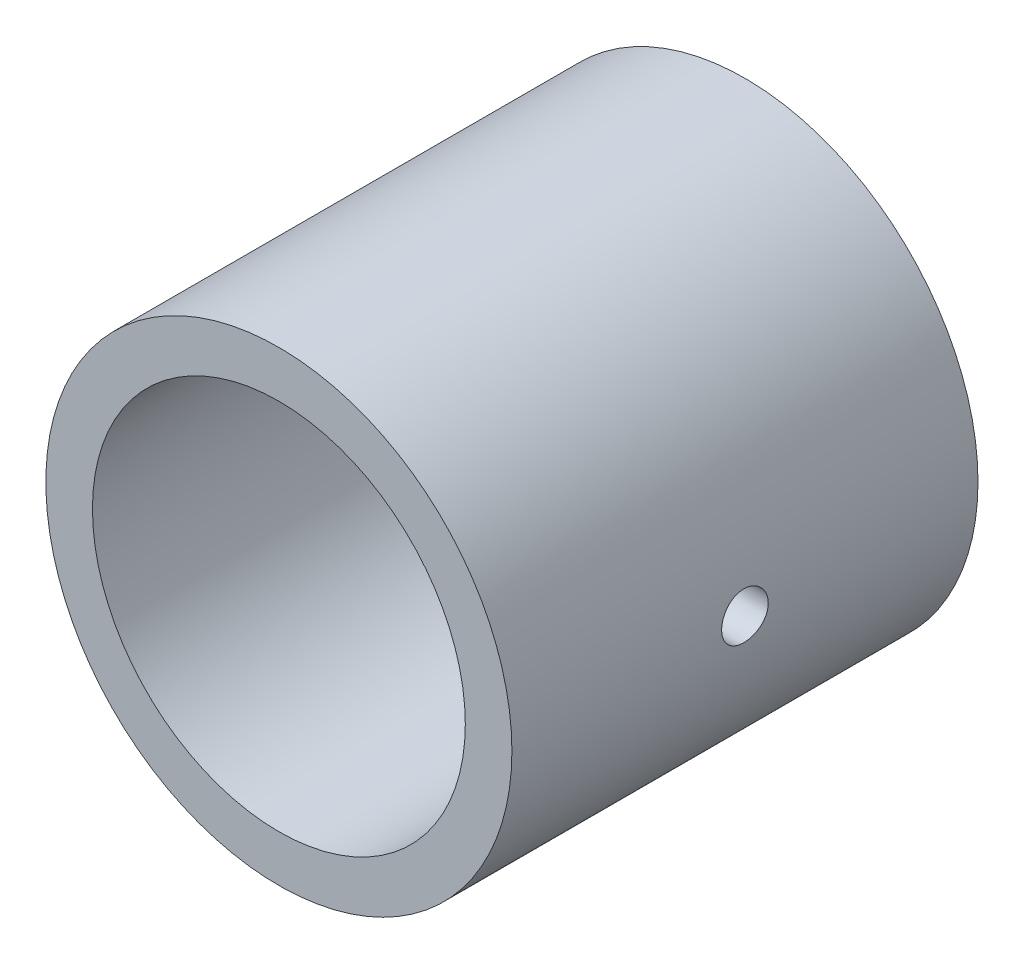
ISO-10303-21;
HEADER;
FILE_DESCRIPTION(('STEP AP214'),'2;1');
FILE_NAME('part.step','',(''),(''),'','','');
FILE_SCHEMA(('AUTOMOTIVE_DESIGN { 1 0 10303 214 1 1 1 1 }'));
ENDSEC;
DATA;
#1=APPLICATION_CONTEXT('core data for automotive mechanical design processes');
#2=APPLICATION_PROTOCOL_DEFINITION('international standard','automotive_design',2000,#1);
#3=PRODUCT_CONTEXT('',#1,'mechanical');
#4=PRODUCT('Part','Part','',(#3));
#5=PRODUCT_RELATED_PRODUCT_CATEGORY('part','',(#4));
#6=PRODUCT_DEFINITION_FORMATION('','',#4);
#7=PRODUCT_DEFINITION_CONTEXT('part definition',#1,'design');
#8=PRODUCT_DEFINITION('design','',#6,#7);
#9=PRODUCT_DEFINITION_SHAPE('','',#8);
#10=(LENGTH_UNIT() NAMED_UNIT(*) SI_UNIT(.MILLI.,.METRE.));
#11=(NAMED_UNIT(*) PLANE_ANGLE_UNIT() SI_UNIT($,.RADIAN.));
#12=(NAMED_UNIT(*) SI_UNIT($,.STERADIAN.) SOLID_ANGLE_UNIT());
#13=UNCERTAINTY_MEASURE_WITH_UNIT(LENGTH_MEASURE(1.E-05),#10,'distance_accuracy_value','');
#14=(GEOMETRIC_REPRESENTATION_CONTEXT(3) GLOBAL_UNCERTAINTY_ASSIGNED_CONTEXT((#13)) GLOBAL_UNIT_ASSIGNED_CONTEXT((#10,
#11,#12)) REPRESENTATION_CONTEXT('',''));
#15=CARTESIAN_POINT('',(0.,0.,0.));
#16=DIRECTION('',(0.,0.,1.));
#17=DIRECTION('',(1.,0.,0.));
#18=AXIS2_PLACEMENT_3D('',#15,#16,#17);
#19=CARTESIAN_POINT('',(0.,0.,50.));
#20=DIRECTION('',(0.,0.,-1.));
#21=DIRECTION('',(-1.,0.,0.));
#22=AXIS2_PLACEMENT_3D('',#19,#20,#21);
#23=CYLINDRICAL_SURFACE('',#22,25.);
#24=CARTESIAN_POINT('',(0.,0.,50.));
#25=DIRECTION('',(0.,0.,1.));
#26=DIRECTION('',(1.,0.,0.));
#27=AXIS2_PLACEMENT_3D('',#24,#25,#26);
#28=CIRCLE('',#27,25.);
#29=CARTESIAN_POINT('',(25.,0.,50.));
#30=VERTEX_POINT('',#29);
#31=EDGE_CURVE('E10',#30,#30,#28,.T.);
#32=ORIENTED_EDGE('',*,*,#31,.F.);
#33=EDGE_LOOP('',(#32));
#34=FACE_BOUND('',#33,.T.);
#35=CARTESIAN_POINT('',(0.,0.,0.));
#36=DIRECTION('',(0.,0.,1.));
#37=DIRECTION('',(1.,0.,0.));
#38=AXIS2_PLACEMENT_3D('',#35,#36,#37);
#39=CIRCLE('',#38,25.);
#40=CARTESIAN_POINT('',(25.,0.,0.));
#41=VERTEX_POINT('',#40);
#42=EDGE_CURVE('E42',#41,#41,#39,.T.);
#43=ORIENTED_EDGE('',*,*,#42,.T.);
#44=EDGE_LOOP('',(#43));
#45=FACE_BOUND('',#44,.T.);
#46=CARTESIAN_POINT('',(25.,0.,27.5));
#47=CARTESIAN_POINT('',(24.9999983880192,-0.140050884478893,27.4999939352491));
#48=CARTESIAN_POINT('',(24.9988106399051,-0.280194362919433,27.4881918277589));
#49=CARTESIAN_POINT('',(24.9941866898684,-0.556595996242092,27.4412890742739));
#50=CARTESIAN_POINT('',(24.9907480108506,-0.69284969792207,27.4061627599385));
#51=CARTESIAN_POINT('',(24.9820103640768,-0.957429188633536,27.3136443985054));
#52=CARTESIAN_POINT('',(24.9767125200177,-1.08575971153727,27.2562657987038));
#53=CARTESIAN_POINT('',(24.9648489348577,-1.33094040240102,27.1208977301709));
#54=CARTESIAN_POINT('',(24.9582834459533,-1.44779284694769,27.0429123599997));
#55=CARTESIAN_POINT('',(24.9445936085331,-1.6671488766852,26.8682432558443));
#56=CARTESIAN_POINT('',(24.9374675393466,-1.76960536208723,26.7715005014949));
#57=CARTESIAN_POINT('',(24.9234739226566,-1.95685630357746,26.5621886643424));
#58=CARTESIAN_POINT('',(24.9166063871229,-2.04164994270663,26.449618849894));
#59=CARTESIAN_POINT('',(24.9038897888196,-2.19133492610904,26.2115536707909));
#60=CARTESIAN_POINT('',(24.8980429177726,-2.2561836636372,26.0860313897629));
#61=CARTESIAN_POINT('',(24.8880509386631,-2.3638659618569,25.8258110352376));
#62=CARTESIAN_POINT('',(24.8839057885556,-2.40670006647823,25.6911131885401));
#63=CARTESIAN_POINT('',(24.8778021018244,-2.46899760400473,25.416845497835));
#64=CARTESIAN_POINT('',(24.8758362599524,-2.48853913250949,25.2772935578695));
#65=CARTESIAN_POINT('',(24.8742910765131,-2.5039382128384,24.9968778415105));
#66=CARTESIAN_POINT('',(24.8747116722186,-2.499796387177,24.8560140996948));
#67=CARTESIAN_POINT('',(24.8778851724734,-2.46801070063169,24.5775117257667));
#68=CARTESIAN_POINT('',(24.8806296147663,-2.44045211031138,24.4398632516783));
#69=CARTESIAN_POINT('',(24.8881283571855,-2.36274786037646,24.1711550919973));
#70=CARTESIAN_POINT('',(24.8928826844623,-2.31260189563936,24.0400954954374));
#71=CARTESIAN_POINT('',(24.9038752363018,-2.19105223470377,23.7880160317528));
#72=CARTESIAN_POINT('',(24.9101160977039,-2.11961070679995,23.6670145262767));
#73=CARTESIAN_POINT('',(24.923376293322,-1.95752506838307,23.4386869627203));
#74=CARTESIAN_POINT('',(24.9303956503196,-1.86688039584126,23.3313613050456));
#75=CARTESIAN_POINT('',(24.9444596328247,-1.66848528103017,23.1329365150274));
#76=CARTESIAN_POINT('',(24.9515042333249,-1.56066119712841,23.041910995298));
#77=CARTESIAN_POINT('',(24.964795726963,-1.33122370434278,22.879240917724));
#78=CARTESIAN_POINT('',(24.9710426192064,-1.209610279999,22.8075963816088));
#79=CARTESIAN_POINT('',(24.9820368916774,-0.95599526423091,22.6857249492244));
#80=CARTESIAN_POINT('',(24.9867840103692,-0.823991865974757,22.6355017879549));
#81=CARTESIAN_POINT('',(24.9942411860352,-0.553368043324829,22.5579527082206));
#82=CARTESIAN_POINT('',(24.9969513039266,-0.4147478169415,22.5306261050234));
#83=CARTESIAN_POINT('',(25.0000212917078,-0.135462747729758,22.4997392306631));
#84=CARTESIAN_POINT('',(25.0003912066934,0.00519075526373062,22.4960773793688));
#85=CARTESIAN_POINT('',(24.9987660439199,0.28510948328925,22.5123571576219));
#86=CARTESIAN_POINT('',(24.9967709981117,0.424374727051175,22.5322984682882));
#87=CARTESIAN_POINT('',(24.9906465384799,0.697270517086687,22.5951342385539));
#88=CARTESIAN_POINT('',(24.986521547951,0.830912122430048,22.637981136195));
#89=CARTESIAN_POINT('',(24.9765999715152,1.08911080345945,22.7453629350932));
#90=CARTESIAN_POINT('',(24.9708033481313,1.21366767539279,22.8098983225985));
#91=CARTESIAN_POINT('',(24.9581618832606,1.45062045043035,22.9590770966598));
#92=CARTESIAN_POINT('',(24.951313590086,1.56297414937229,23.0437872223145));
#93=CARTESIAN_POINT('',(24.937348321738,1.77190405827969,23.2308151693523));
#94=CARTESIAN_POINT('',(24.9302313398243,1.86847987212294,23.3331334326758));
#95=CARTESIAN_POINT('',(24.9165006035189,2.04346527471786,23.5529164366475));
#96=CARTESIAN_POINT('',(24.9098887534744,2.12180819669886,23.6704343913566));
#97=CARTESIAN_POINT('',(24.8979458115222,2.25764564685957,23.9170184003667));
#98=CARTESIAN_POINT('',(24.8926147021009,2.3151404601347,24.046084296721));
#99=CARTESIAN_POINT('',(24.8838486908512,2.40753802171119,24.3118718486645));
#100=CARTESIAN_POINT('',(24.8804104612447,2.44248043702965,24.4485796002278));
#101=CARTESIAN_POINT('',(24.8758091320719,2.48891001782366,24.7259579949019));
#102=CARTESIAN_POINT('',(24.8746459672546,2.50039785599879,24.8666285242392));
#103=CARTESIAN_POINT('',(24.8747278276891,2.49958284617814,25.1472767208918));
#104=CARTESIAN_POINT('',(24.8759622521752,2.48738472398278,25.287254707207));
#105=CARTESIAN_POINT('',(24.8806775972387,2.43976363240913,25.5631622929207));
#106=CARTESIAN_POINT('',(24.884158520343,2.4043406369054,25.699091887765));
#107=CARTESIAN_POINT('',(24.8929717065797,2.31130421574375,25.9630433726196));
#108=CARTESIAN_POINT('',(24.898303713509,2.25369386085229,26.0910663540743));
#109=CARTESIAN_POINT('',(24.910218795984,2.11792888727761,26.3356422291776));
#110=CARTESIAN_POINT('',(24.9168018645238,2.03977438363853,26.4521951870516));
#111=CARTESIAN_POINT('',(24.9305121802424,1.86474639071333,26.6710591861798));
#112=CARTESIAN_POINT('',(24.9376416181688,1.76779487222567,26.7733076909177));
#113=CARTESIAN_POINT('',(24.9516213682196,1.55807924806277,26.9601305817491));
#114=CARTESIAN_POINT('',(24.9584716130744,1.44531136027064,27.0447007283929));
#115=CARTESIAN_POINT('',(24.971139051729,1.20685358540322,27.1939336346366));
#116=CARTESIAN_POINT('',(24.9769536006703,1.08113187336691,27.258545727363));
#117=CARTESIAN_POINT('',(24.9868657312474,0.820645697751375,27.3656560570597));
#118=CARTESIAN_POINT('',(24.9909652477413,0.685891624564022,27.4081792273839));
#119=CARTESIAN_POINT('',(24.9959553443433,0.45864565351426,27.459301542712));
#120=CARTESIAN_POINT('',(24.9974650172958,0.367606382111272,27.4745426107484));
#121=CARTESIAN_POINT('',(24.9994878737697,0.184391452043282,27.4948938151544));
#122=CARTESIAN_POINT('',(25.0000010614006,0.0922157980663946,27.5000039933047));
#123=CARTESIAN_POINT('',(25.,0.,27.5));
#124=B_SPLINE_CURVE_WITH_KNOTS('',3,(#46,#47,#48,#49,#50,#51,#52,#53,#54,#55,#56,#57,#58,#59,
#60,#61,#62,#63,#64,#65,#66,#67,#68,#69,#70,#71,#72,#73,#74,#75,#76,#77,#78,#79,#80,#81,#82,#83,
#84,#85,#86,#87,#88,#89,#90,#91,#92,#93,#94,#95,#96,#97,#98,#99,#100,#101,#102,#103,#104,#105,
#106,#107,#108,#109,#110,#111,#112,#113,#114,#115,#116,#117,#118,#119,#120,#121,#122,#123),
.UNSPECIFIED.,.T.,.F.,(4,2,2,2,2,2,2,2,2,2,2,2,2,2,2,2,2,2,2,2,2,2,2,2,2,2,2,2,2,2,2,2,2,2,2,2,
2,2,4),(0.,0.419815915671184,0.840094607088716,1.26011971433051,1.68006134395696,
2.10134642155736,2.52265098051764,2.94484938680554,3.3670373610626,3.78780580112992,
4.20856318139441,4.62779493602777,5.04703235404084,5.46701903432237,5.88701800827813,
6.30886835490516,6.73071917449429,7.15264351733953,7.57455524188598,7.99465471519394,
8.41474851297858,8.83397338235762,9.25320765123667,9.67384851871745,10.0944999452557,
10.516666090215,10.9388264618843,11.3602422648251,11.7816459809896,12.2011907323489,
12.620735955651,13.04022313407,13.459707963474,13.8809729356913,14.3023388159239,
14.724765775656,15.1467148698824,15.4231416808087,15.6995673517257),.UNSPECIFIED.);
#125=CARTESIAN_POINT('',(25.,0.,27.5));
#126=VERTEX_POINT('',#125);
#127=EDGE_CURVE('E70',#126,#126,#124,.T.);
#128=ORIENTED_EDGE('',*,*,#127,.F.);
#129=EDGE_LOOP('',(#128));
#130=FACE_BOUND('',#129,.T.);
#131=CARTESIAN_POINT('',(-25.,0.,27.5));
#132=CARTESIAN_POINT('',(-24.9999983880192,0.140050884478893,27.4999939352491));
#133=CARTESIAN_POINT('',(-24.9988106399051,0.280194362919433,27.4881918277589));
#134=CARTESIAN_POINT('',(-24.9941866898684,0.556595996242092,27.4412890742739));
#135=CARTESIAN_POINT('',(-24.9907480108506,0.69284969792207,27.4061627599385));
#136=CARTESIAN_POINT('',(-24.9820103640768,0.957429188633536,27.3136443985054));
#137=CARTESIAN_POINT('',(-24.9767125200177,1.08575971153727,27.2562657987038));
#138=CARTESIAN_POINT('',(-24.9648489348577,1.33094040240102,27.1208977301709));
#139=CARTESIAN_POINT('',(-24.9582834459533,1.44779284694769,27.0429123599997));
#140=CARTESIAN_POINT('',(-24.9445936085331,1.6671488766852,26.8682432558443));
#141=CARTESIAN_POINT('',(-24.9374675393466,1.76960536208723,26.7715005014949));
#142=CARTESIAN_POINT('',(-24.9234739226566,1.95685630357746,26.5621886643424));
#143=CARTESIAN_POINT('',(-24.9166063871229,2.04164994270663,26.449618849894));
#144=CARTESIAN_POINT('',(-24.9038897888196,2.19133492610904,26.2115536707909));
#145=CARTESIAN_POINT('',(-24.8980429177726,2.2561836636372,26.0860313897629));
#146=CARTESIAN_POINT('',(-24.8880509386631,2.3638659618569,25.8258110352376));
#147=CARTESIAN_POINT('',(-24.8839057885556,2.40670006647823,25.6911131885401));
#148=CARTESIAN_POINT('',(-24.8778021018244,2.46899760400473,25.416845497835));
#149=CARTESIAN_POINT('',(-24.8758362599524,2.48853913250949,25.2772935578695));
#150=CARTESIAN_POINT('',(-24.8742910765131,2.5039382128384,24.9968778415105));
#151=CARTESIAN_POINT('',(-24.8747116722186,2.499796387177,24.8560140996948));
#152=CARTESIAN_POINT('',(-24.8778851724734,2.46801070063169,24.5775117257667));
#153=CARTESIAN_POINT('',(-24.8806296147663,2.44045211031138,24.4398632516783));
#154=CARTESIAN_POINT('',(-24.8881283571855,2.36274786037646,24.1711550919973));
#155=CARTESIAN_POINT('',(-24.8928826844623,2.31260189563936,24.0400954954374));
#156=CARTESIAN_POINT('',(-24.9038752363018,2.19105223470377,23.7880160317528));
#157=CARTESIAN_POINT('',(-24.9101160977039,2.11961070679995,23.6670145262767));
#158=CARTESIAN_POINT('',(-24.923376293322,1.95752506838307,23.4386869627203));
#159=CARTESIAN_POINT('',(-24.9303956503196,1.86688039584126,23.3313613050456));
#160=CARTESIAN_POINT('',(-24.9444596328247,1.66848528103017,23.1329365150274));
#161=CARTESIAN_POINT('',(-24.9515042333249,1.56066119712841,23.041910995298));
#162=CARTESIAN_POINT('',(-24.964795726963,1.33122370434278,22.879240917724));
#163=CARTESIAN_POINT('',(-24.9710426192064,1.209610279999,22.8075963816088));
#164=CARTESIAN_POINT('',(-24.9820368916774,0.95599526423091,22.6857249492244));
#165=CARTESIAN_POINT('',(-24.9867840103692,0.823991865974757,22.6355017879549));
#166=CARTESIAN_POINT('',(-24.9942411860352,0.553368043324829,22.5579527082206));
#167=CARTESIAN_POINT('',(-24.9969513039266,0.4147478169415,22.5306261050234));
#168=CARTESIAN_POINT('',(-25.0000212917078,0.135462747729758,22.4997392306631));
#169=CARTESIAN_POINT('',(-25.0003912066934,-0.00519075526373062,22.4960773793688));
#170=CARTESIAN_POINT('',(-24.9987660439199,-0.28510948328925,22.5123571576219));
#171=CARTESIAN_POINT('',(-24.9967709981117,-0.424374727051175,22.5322984682882));
#172=CARTESIAN_POINT('',(-24.9906465384799,-0.697270517086687,22.5951342385539));
#173=CARTESIAN_POINT('',(-24.986521547951,-0.830912122430048,22.637981136195));
#174=CARTESIAN_POINT('',(-24.9765999715152,-1.08911080345945,22.7453629350932));
#175=CARTESIAN_POINT('',(-24.9708033481313,-1.21366767539279,22.8098983225985));
#176=CARTESIAN_POINT('',(-24.9581618832606,-1.45062045043035,22.9590770966598));
#177=CARTESIAN_POINT('',(-24.951313590086,-1.56297414937229,23.0437872223145));
#178=CARTESIAN_POINT('',(-24.937348321738,-1.77190405827969,23.2308151693523));
#179=CARTESIAN_POINT('',(-24.9302313398243,-1.86847987212294,23.3331334326758));
#180=CARTESIAN_POINT('',(-24.9165006035189,-2.04346527471786,23.5529164366475));
#181=CARTESIAN_POINT('',(-24.9098887534744,-2.12180819669886,23.6704343913566));
#182=CARTESIAN_POINT('',(-24.8979458115222,-2.25764564685957,23.9170184003667));
#183=CARTESIAN_POINT('',(-24.8926147021009,-2.3151404601347,24.046084296721));
#184=CARTESIAN_POINT('',(-24.8838486908512,-2.40753802171119,24.3118718486645));
#185=CARTESIAN_POINT('',(-24.8804104612447,-2.44248043702965,24.4485796002278));
#186=CARTESIAN_POINT('',(-24.8758091320719,-2.48891001782366,24.7259579949019));
#187=CARTESIAN_POINT('',(-24.8746459672546,-2.50039785599879,24.8666285242392));
#188=CARTESIAN_POINT('',(-24.8747278276891,-2.49958284617814,25.1472767208918));
#189=CARTESIAN_POINT('',(-24.8759622521752,-2.48738472398278,25.287254707207));
#190=CARTESIAN_POINT('',(-24.8806775972387,-2.43976363240913,25.5631622929207));
#191=CARTESIAN_POINT('',(-24.884158520343,-2.4043406369054,25.699091887765));
#192=CARTESIAN_POINT('',(-24.8929717065797,-2.31130421574375,25.9630433726196));
#193=CARTESIAN_POINT('',(-24.898303713509,-2.25369386085229,26.0910663540743));
#194=CARTESIAN_POINT('',(-24.910218795984,-2.11792888727761,26.3356422291776));
#195=CARTESIAN_POINT('',(-24.9168018645238,-2.03977438363853,26.4521951870516));
#196=CARTESIAN_POINT('',(-24.9305121802424,-1.86474639071333,26.6710591861798));
#197=CARTESIAN_POINT('',(-24.9376416181688,-1.76779487222567,26.7733076909177));
#198=CARTESIAN_POINT('',(-24.9516213682196,-1.55807924806277,26.9601305817491));
#199=CARTESIAN_POINT('',(-24.9584716130744,-1.44531136027064,27.0447007283929));
#200=CARTESIAN_POINT('',(-24.971139051729,-1.20685358540322,27.1939336346366));
#201=CARTESIAN_POINT('',(-24.9769536006703,-1.08113187336691,27.258545727363));
#202=CARTESIAN_POINT('',(-24.9868657312474,-0.820645697751375,27.3656560570597));
#203=CARTESIAN_POINT('',(-24.9909652477413,-0.685891624564022,27.4081792273839));
#204=CARTESIAN_POINT('',(-24.9959553443433,-0.45864565351426,27.459301542712));
#205=CARTESIAN_POINT('',(-24.9974650172958,-0.367606382111272,27.4745426107484));
#206=CARTESIAN_POINT('',(-24.9994878737697,-0.184391452043282,27.4948938151544));
#207=CARTESIAN_POINT('',(-25.0000010614006,-0.0922157980663946,27.5000039933047));
#208=CARTESIAN_POINT('',(-25.,0.,27.5));
#209=B_SPLINE_CURVE_WITH_KNOTS('',3,(#131,#132,#133,#134,#135,#136,#137,#138,#139,#140,#141,
#142,#143,#144,#145,#146,#147,#148,#149,#150,#151,#152,#153,#154,#155,#156,#157,#158,#159,#160,
#161,#162,#163,#164,#165,#166,#167,#168,#169,#170,#171,#172,#173,#174,#175,#176,#177,#178,#179,
#180,#181,#182,#183,#184,#185,#186,#187,#188,#189,#190,#191,#192,#193,#194,#195,#196,#197,#198,
#199,#200,#201,#202,#203,#204,#205,#206,#207,#208),.UNSPECIFIED.,.T.,.F.,(4,2,2,2,2,2,2,2,2,2,2,
2,2,2,2,2,2,2,2,2,2,2,2,2,2,2,2,2,2,2,2,2,2,2,2,2,2,2,4),(0.,0.419815915671184,
0.840094607088716,1.26011971433051,1.68006134395696,2.10134642155736,2.52265098051764,
2.94484938680554,3.3670373610626,3.78780580112992,4.20856318139441,4.62779493602777,
5.04703235404084,5.46701903432237,5.88701800827813,6.30886835490516,6.73071917449429,
7.15264351733953,7.57455524188598,7.99465471519394,8.41474851297858,8.83397338235762,
9.25320765123667,9.67384851871745,10.0944999452557,10.516666090215,10.9388264618843,
11.3602422648251,11.7816459809896,12.2011907323489,12.620735955651,13.04022313407,
13.459707963474,13.8809729356913,14.3023388159239,14.724765775656,15.1467148698824,
15.4231416808087,15.6995673517257),.UNSPECIFIED.);
#210=CARTESIAN_POINT('',(-25.,0.,27.5));
#211=VERTEX_POINT('',#210);
#212=EDGE_CURVE('E74',#211,#211,#209,.T.);
#213=ORIENTED_EDGE('',*,*,#212,.F.);
#214=EDGE_LOOP('',(#213));
#215=FACE_BOUND('',#214,.T.);
#216=ADVANCED_FACE('F30',(#34,#45,#130,#215),#23,.T.);
#217=CARTESIAN_POINT('',(0.,0.,0.));
#218=DIRECTION('',(0.,0.,1.));
#219=DIRECTION('',(1.,0.,0.));
#220=AXIS2_PLACEMENT_3D('',#217,#218,#219);
#221=CYLINDRICAL_SURFACE('',#220,20.);
#222=CARTESIAN_POINT('',(0.,0.,0.));
#223=DIRECTION('',(0.,0.,1.));
#224=DIRECTION('',(1.,0.,0.));
#225=AXIS2_PLACEMENT_3D('',#222,#223,#224);
#226=CIRCLE('',#225,20.);
#227=CARTESIAN_POINT('',(20.,0.,0.));
#228=VERTEX_POINT('',#227);
#229=EDGE_CURVE('E47',#228,#228,#226,.T.);
#230=ORIENTED_EDGE('',*,*,#229,.F.);
#231=EDGE_LOOP('',(#230));
#232=FACE_BOUND('',#231,.T.);
#233=CARTESIAN_POINT('',(0.,0.,50.));
#234=DIRECTION('',(0.,0.,1.));
#235=DIRECTION('',(1.,0.,0.));
#236=AXIS2_PLACEMENT_3D('',#233,#234,#235);
#237=CIRCLE('',#236,20.);
#238=CARTESIAN_POINT('',(20.,0.,50.));
#239=VERTEX_POINT('',#238);
#240=EDGE_CURVE('E50',#239,#239,#237,.T.);
#241=ORIENTED_EDGE('',*,*,#240,.T.);
#242=EDGE_LOOP('',(#241));
#243=FACE_BOUND('',#242,.T.);
#244=CARTESIAN_POINT('',(-20.,0.,27.5));
#245=CARTESIAN_POINT('',(-19.9999980489643,-0.139841095555761,27.4999940590643));
#246=CARTESIAN_POINT('',(-19.998517845549,-0.279769574302747,27.4882271208307));
#247=CARTESIAN_POINT('',(-19.9927554011136,-0.555732802089753,27.4414722454292));
#248=CARTESIAN_POINT('',(-19.9884702344143,-0.691763330623744,27.4064600620766));
#249=CARTESIAN_POINT('',(-19.9775806104441,-0.955895574813054,27.3142623560859));
#250=CARTESIAN_POINT('',(-19.9709777145554,-1.08400256014614,27.2570917581901));
#251=CARTESIAN_POINT('',(-19.956187008781,-1.32877947489304,27.1222327160302));
#252=CARTESIAN_POINT('',(-19.9479994708412,-1.44545136155637,27.0445477914693));
#253=CARTESIAN_POINT('',(-19.9309032130633,-1.66471281693132,26.8704080501604));
#254=CARTESIAN_POINT('',(-19.9219911469242,-1.76723036493713,26.7738628706538));
#255=CARTESIAN_POINT('',(-19.9044772600975,-1.95465279355749,26.5649371764634));
#256=CARTESIAN_POINT('',(-19.8958754552427,-2.03955677639225,26.4525558550868));
#257=CARTESIAN_POINT('',(-19.8799230561958,-2.18961016128394,26.2146800224343));
#258=CARTESIAN_POINT('',(-19.8725767717791,-2.25469209594107,26.0891426384321));
#259=CARTESIAN_POINT('',(-19.8600112845768,-2.36282307657511,25.8288129480526));
#260=CARTESIAN_POINT('',(-19.8547920011314,-2.40587295806521,25.694020992853));
#261=CARTESIAN_POINT('',(-19.8471033960361,-2.46849898002476,25.4197558044132));
#262=CARTESIAN_POINT('',(-19.8446198343674,-2.4881967147317,25.2803107422958));
#263=CARTESIAN_POINT('',(-19.8426402814279,-2.50393554955723,25.0000737365282));
#264=CARTESIAN_POINT('',(-19.8431441700151,-2.49997760100241,24.8592818472687));
#265=CARTESIAN_POINT('',(-19.8470695536975,-2.4686172364479,24.5811951727512));
#266=CARTESIAN_POINT('',(-19.8504743796033,-2.4413487629847,24.4438850137997));
#267=CARTESIAN_POINT('',(-19.8597919975763,-2.36435038318205,24.175804978781));
#268=CARTESIAN_POINT('',(-19.8657048404572,-2.3146200217519,24.045035235286));
#269=CARTESIAN_POINT('',(-19.8793911586465,-2.19396555991165,23.7933320009783));
#270=CARTESIAN_POINT('',(-19.8871697321144,-2.12298325370763,23.672426699751));
#271=CARTESIAN_POINT('',(-19.903707114306,-1.96188146945692,23.4441933055868));
#272=CARTESIAN_POINT('',(-19.9124659678566,-1.87176111608077,23.3368658340263));
#273=CARTESIAN_POINT('',(-19.9300510989042,-1.67419911075378,23.1380572892773));
#274=CARTESIAN_POINT('',(-19.9388774238689,-1.56664200784001,23.046690908234));
#275=CARTESIAN_POINT('',(-19.9555463255585,-1.33765716911392,22.8832911199695));
#276=CARTESIAN_POINT('',(-19.9633889000151,-1.21622940131825,22.811257757328));
#277=CARTESIAN_POINT('',(-19.9772115221858,-0.96286167136348,22.6885686795361));
#278=CARTESIAN_POINT('',(-19.9831909440154,-0.830918195337715,22.6379201461188));
#279=CARTESIAN_POINT('',(-19.9926078578006,-0.560307940431054,22.5595295064767));
#280=CARTESIAN_POINT('',(-19.9960454687587,-0.421641476630665,22.531786327863));
#281=CARTESIAN_POINT('',(-19.9999759641076,-0.142513163913495,22.5001425757394));
#282=CARTESIAN_POINT('',(-20.0004883614264,-0.00206949019860496,22.4960840076359));
#283=CARTESIAN_POINT('',(-19.9985633800543,0.277496036497498,22.511507734056));
#284=CARTESIAN_POINT('',(-19.9961260641821,0.416617917564708,22.5309895272516));
#285=CARTESIAN_POINT('',(-19.9885876875669,0.689124507721523,22.5928097087744));
#286=CARTESIAN_POINT('',(-19.9834954081387,0.822526570424706,22.6350727634026));
#287=CARTESIAN_POINT('',(-19.971217231002,1.08034965485841,22.7411774519129));
#288=CARTESIAN_POINT('',(-19.9640312622062,1.20477037146532,22.8050198184914));
#289=CARTESIAN_POINT('',(-19.9483182291011,1.44180452068743,22.9528531375075));
#290=CARTESIAN_POINT('',(-19.9397844404251,1.55435375994382,23.0369462898056));
#291=CARTESIAN_POINT('',(-19.9223514232566,1.76379698962632,23.2227494975342));
#292=CARTESIAN_POINT('',(-19.913452180269,1.86069035833686,23.324460252251));
#293=CARTESIAN_POINT('',(-19.8962310546258,2.03663195881802,23.5433074167571));
#294=CARTESIAN_POINT('',(-19.8879127472133,2.11557546056793,23.6605283463104));
#295=CARTESIAN_POINT('',(-19.8728541103715,2.2526528894435,23.9066582448547));
#296=CARTESIAN_POINT('',(-19.8661137493103,2.31078723372837,24.0355669794765));
#297=CARTESIAN_POINT('',(-19.85499850393,2.40442657886654,24.3010753191476));
#298=CARTESIAN_POINT('',(-19.8506174518479,2.43999062745711,24.437653830048));
#299=CARTESIAN_POINT('',(-19.8446991590745,2.48766999386785,24.7149024837807));
#300=CARTESIAN_POINT('',(-19.8431617860878,2.49978640253576,24.855572435959));
#301=CARTESIAN_POINT('',(-19.8431087698246,2.50020653608483,25.1359689292047));
#302=CARTESIAN_POINT('',(-19.8445722475195,2.48867479769927,25.2756952483319));
#303=CARTESIAN_POINT('',(-19.850311145372,2.44247440484932,25.5512071293451));
#304=CARTESIAN_POINT('',(-19.8545865658308,2.40780574790577,25.6869926908088));
#305=CARTESIAN_POINT('',(-19.8654611577455,2.31636707368965,25.9507469567664));
#306=CARTESIAN_POINT('',(-19.8720594959278,2.25960498097093,26.0787184450218));
#307=CARTESIAN_POINT('',(-19.8868378324482,2.1256069021503,26.3233466540483));
#308=CARTESIAN_POINT('',(-19.8950178506041,2.04837065950958,26.4400032330198));
#309=CARTESIAN_POINT('',(-19.9121060475223,1.87500633126583,26.6595312253405));
#310=CARTESIAN_POINT('',(-19.9210187208403,1.77875562577495,26.762305460955));
#311=CARTESIAN_POINT('',(-19.938528315929,1.57035022696838,26.950306825168));
#312=CARTESIAN_POINT('',(-19.9471251627559,1.45819178914156,27.0355298107743));
#313=CARTESIAN_POINT('',(-19.9630705658675,1.22066562085421,27.1862853571053));
#314=CARTESIAN_POINT('',(-19.970414250783,1.09524927959617,27.2517418058993));
#315=CARTESIAN_POINT('',(-19.9829764907672,0.835182902301279,27.3605712429163));
#316=CARTESIAN_POINT('',(-19.9881973536958,0.700543080870234,27.4039682263535));
#317=CARTESIAN_POINT('',(-19.9946672032775,0.471005771967923,27.4570593381713));
#318=CARTESIAN_POINT('',(-19.9966572589545,0.377555663516919,27.4731389419821));
#319=CARTESIAN_POINT('',(-19.9993243132919,0.189417063212434,27.4946112456932));
#320=CARTESIAN_POINT('',(-20.0000013216347,0.0947285804960269,27.5000040243993));
#321=CARTESIAN_POINT('',(-20.,0.,27.5));
#322=B_SPLINE_CURVE_WITH_KNOTS('',3,(#244,#245,#246,#247,#248,#249,#250,#251,#252,#253,#254,
#255,#256,#257,#258,#259,#260,#261,#262,#263,#264,#265,#266,#267,#268,#269,#270,#271,#272,#273,
#274,#275,#276,#277,#278,#279,#280,#281,#282,#283,#284,#285,#286,#287,#288,#289,#290,#291,#292,
#293,#294,#295,#296,#297,#298,#299,#300,#301,#302,#303,#304,#305,#306,#307,#308,#309,#310,#311,
#312,#313,#314,#315,#316,#317,#318,#319,#320,#321),.UNSPECIFIED.,.T.,.F.,(4,2,2,2,2,2,2,2,2,2,2,
2,2,2,2,2,2,2,2,2,2,2,2,2,2,2,2,2,2,2,2,2,2,2,2,2,2,2,4),(0.,0.419177272776247,
0.838792460943427,1.25812550818177,1.67738665591073,2.09870813201843,2.5200510780001,
2.94281250318869,3.36555789496807,3.78609225286321,4.20660969884664,4.62472696441691,
5.04285270166241,5.46213426285533,5.88143500513639,6.30363478136416,6.72583553113113,
7.14817795731605,7.5705006090378,7.99000279391921,8.40949604501928,8.82761053893396,
9.24573923078947,9.66602402928422,10.0863255137509,10.5090197150757,10.9317054422154,
11.3532807428092,11.7748364301062,12.1934690120221,12.6121016387955,13.0305842470649,
13.4490720991226,13.8703523769183,14.2917319847001,14.7147140303685,15.1372349868403,
15.4211884318763,15.7051397830044),.UNSPECIFIED.);
#323=CARTESIAN_POINT('',(-20.,0.,27.5));
#324=VERTEX_POINT('',#323);
#325=EDGE_CURVE('E52',#324,#324,#322,.T.);
#326=ORIENTED_EDGE('',*,*,#325,.F.);
#327=EDGE_LOOP('',(#326));
#328=FACE_BOUND('',#327,.T.);
#329=CARTESIAN_POINT('',(20.,0.,22.5));
#330=CARTESIAN_POINT('',(19.9999980489643,-0.139841095555761,22.5000059409357));
#331=CARTESIAN_POINT('',(19.998517845549,-0.279769574302747,22.5117728791693));
#332=CARTESIAN_POINT('',(19.9927554011136,-0.555732802089753,22.5585277545708));
#333=CARTESIAN_POINT('',(19.9884702344143,-0.691763330623744,22.5935399379234));
#334=CARTESIAN_POINT('',(19.9775806104441,-0.955895574813054,22.6857376439141));
#335=CARTESIAN_POINT('',(19.9709777145554,-1.08400256014614,22.7429082418099));
#336=CARTESIAN_POINT('',(19.956187008781,-1.32877947489304,22.8777672839698));
#337=CARTESIAN_POINT('',(19.9479994708412,-1.44545136155637,22.9554522085307));
#338=CARTESIAN_POINT('',(19.9309032130633,-1.66471281693132,23.1295919498396));
#339=CARTESIAN_POINT('',(19.9219911469242,-1.76723036493713,23.2261371293462));
#340=CARTESIAN_POINT('',(19.9044772600975,-1.95465279355749,23.4350628235366));
#341=CARTESIAN_POINT('',(19.8958754552427,-2.03955677639225,23.5474441449132));
#342=CARTESIAN_POINT('',(19.8799230561958,-2.18961016128394,23.7853199775657));
#343=CARTESIAN_POINT('',(19.8725767717791,-2.25469209594107,23.9108573615679));
#344=CARTESIAN_POINT('',(19.8600112845768,-2.36282307657511,24.1711870519474));
#345=CARTESIAN_POINT('',(19.8547920011314,-2.40587295806521,24.305979007147));
#346=CARTESIAN_POINT('',(19.8471033960361,-2.46849898002476,24.5802441955868));
#347=CARTESIAN_POINT('',(19.8446198343674,-2.4881967147317,24.7196892577042));
#348=CARTESIAN_POINT('',(19.8426402814279,-2.50393554955723,24.9999262634718));
#349=CARTESIAN_POINT('',(19.8431441700151,-2.49997760100241,25.1407181527313));
#350=CARTESIAN_POINT('',(19.8470695536975,-2.4686172364479,25.4188048272488));
#351=CARTESIAN_POINT('',(19.8504743796033,-2.4413487629847,25.5561149862003));
#352=CARTESIAN_POINT('',(19.8597919975763,-2.36435038318205,25.824195021219));
#353=CARTESIAN_POINT('',(19.8657048404572,-2.3146200217519,25.954964764714));
#354=CARTESIAN_POINT('',(19.8793911586465,-2.19396555991165,26.2066679990217));
#355=CARTESIAN_POINT('',(19.8871697321144,-2.12298325370763,26.327573300249));
#356=CARTESIAN_POINT('',(19.903707114306,-1.96188146945692,26.5558066944132));
#357=CARTESIAN_POINT('',(19.9124659678566,-1.87176111608077,26.6631341659737));
#358=CARTESIAN_POINT('',(19.9300510989042,-1.67419911075378,26.8619427107227));
#359=CARTESIAN_POINT('',(19.9388774238689,-1.56664200784001,26.953309091766));
#360=CARTESIAN_POINT('',(19.9555463255585,-1.33765716911392,27.1167088800305));
#361=CARTESIAN_POINT('',(19.9633889000151,-1.21622940131825,27.188742242672));
#362=CARTESIAN_POINT('',(19.9772115221858,-0.96286167136348,27.3114313204639));
#363=CARTESIAN_POINT('',(19.9831909440154,-0.830918195337715,27.3620798538812));
#364=CARTESIAN_POINT('',(19.9926078578006,-0.560307940431054,27.4404704935233));
#365=CARTESIAN_POINT('',(19.9960454687587,-0.421641476630665,27.4682136721371));
#366=CARTESIAN_POINT('',(19.9999759641076,-0.142513163913495,27.4998574242606));
#367=CARTESIAN_POINT('',(20.0004883614264,-0.00206949019860479,27.5039159923641));
#368=CARTESIAN_POINT('',(19.9985633800543,0.277496036497498,27.488492265944));
#369=CARTESIAN_POINT('',(19.9961260641821,0.416617917564708,27.4690104727484));
#370=CARTESIAN_POINT('',(19.9885876875669,0.689124507721523,27.4071902912256));
#371=CARTESIAN_POINT('',(19.9834954081387,0.822526570424705,27.3649272365974));
#372=CARTESIAN_POINT('',(19.971217231002,1.08034965485841,27.2588225480871));
#373=CARTESIAN_POINT('',(19.9640312622062,1.20477037146531,27.1949801815086));
#374=CARTESIAN_POINT('',(19.9483182291011,1.44180452068743,27.0471468624925));
#375=CARTESIAN_POINT('',(19.9397844404251,1.55435375994382,26.9630537101944));
#376=CARTESIAN_POINT('',(19.9223514232566,1.76379698962632,26.7772505024658));
#377=CARTESIAN_POINT('',(19.913452180269,1.86069035833686,26.675539747749));
#378=CARTESIAN_POINT('',(19.8962310546258,2.03663195881802,26.4566925832429));
#379=CARTESIAN_POINT('',(19.8879127472133,2.11557546056793,26.3394716536896));
#380=CARTESIAN_POINT('',(19.8728541103715,2.2526528894435,26.0933417551453));
#381=CARTESIAN_POINT('',(19.8661137493103,2.31078723372837,25.9644330205235));
#382=CARTESIAN_POINT('',(19.85499850393,2.40442657886654,25.6989246808524));
#383=CARTESIAN_POINT('',(19.8506174518479,2.43999062745711,25.562346169952));
#384=CARTESIAN_POINT('',(19.8446991590745,2.48766999386785,25.2850975162193));
#385=CARTESIAN_POINT('',(19.8431617860878,2.49978640253576,25.144427564041));
#386=CARTESIAN_POINT('',(19.8431087698246,2.50020653608483,24.8640310707953));
#387=CARTESIAN_POINT('',(19.8445722475195,2.48867479769927,24.7243047516681));
#388=CARTESIAN_POINT('',(19.850311145372,2.44247440484932,24.4487928706549));
#389=CARTESIAN_POINT('',(19.8545865658308,2.40780574790577,24.3130073091912));
#390=CARTESIAN_POINT('',(19.8654611577455,2.31636707368965,24.0492530432336));
#391=CARTESIAN_POINT('',(19.8720594959278,2.25960498097093,23.9212815549782));
#392=CARTESIAN_POINT('',(19.8868378324482,2.12560690215031,23.6766533459517));
#393=CARTESIAN_POINT('',(19.8950178506041,2.04837065950959,23.5599967669802));
#394=CARTESIAN_POINT('',(19.9121060475223,1.87500633126583,23.3404687746595));
#395=CARTESIAN_POINT('',(19.9210187208403,1.77875562577495,23.237694539045));
#396=CARTESIAN_POINT('',(19.938528315929,1.57035022696838,23.049693174832));
#397=CARTESIAN_POINT('',(19.9471251627559,1.45819178914156,22.9644701892257));
#398=CARTESIAN_POINT('',(19.9630705658675,1.22066562085421,22.8137146428947));
#399=CARTESIAN_POINT('',(19.970414250783,1.09524927959617,22.7482581941007));
#400=CARTESIAN_POINT('',(19.9829764907672,0.835182902301279,22.6394287570837));
#401=CARTESIAN_POINT('',(19.9881973536958,0.700543080870234,22.5960317736465));
#402=CARTESIAN_POINT('',(19.9946672032775,0.471005771967923,22.5429406618287));
#403=CARTESIAN_POINT('',(19.9966572589545,0.377555663516919,22.5268610580179));
#404=CARTESIAN_POINT('',(19.9993243132919,0.189417063212434,22.5053887543068));
#405=CARTESIAN_POINT('',(20.0000013216347,0.0947285804960269,22.4999959756007));
#406=CARTESIAN_POINT('',(20.,0.,22.5));
#407=B_SPLINE_CURVE_WITH_KNOTS('',3,(#329,#330,#331,#332,#333,#334,#335,#336,#337,#338,#339,
#340,#341,#342,#343,#344,#345,#346,#347,#348,#349,#350,#351,#352,#353,#354,#355,#356,#357,#358,
#359,#360,#361,#362,#363,#364,#365,#366,#367,#368,#369,#370,#371,#372,#373,#374,#375,#376,#377,
#378,#379,#380,#381,#382,#383,#384,#385,#386,#387,#388,#389,#390,#391,#392,#393,#394,#395,#396,
#397,#398,#399,#400,#401,#402,#403,#404,#405,#406),.UNSPECIFIED.,.T.,.F.,(4,2,2,2,2,2,2,2,2,2,2,
2,2,2,2,2,2,2,2,2,2,2,2,2,2,2,2,2,2,2,2,2,2,2,2,2,2,2,4),(0.,0.419177272776247,
0.838792460943427,1.25812550818177,1.67738665591073,2.09870813201843,2.5200510780001,
2.94281250318869,3.36555789496807,3.78609225286321,4.20660969884664,4.62472696441691,
5.04285270166241,5.46213426285533,5.88143500513638,6.30363478136416,6.72583553113113,
7.14817795731605,7.5705006090378,7.99000279391921,8.40949604501928,8.82761053893395,
9.24573923078947,9.66602402928422,10.0863255137509,10.5090197150757,10.9317054422154,
11.3532807428092,11.7748364301062,12.1934690120221,12.6121016387955,13.0305842470649,
13.4490720991226,13.8703523769183,14.2917319847001,14.7147140303685,15.1372349868403,
15.4211884318763,15.7051397830044),.UNSPECIFIED.);
#408=CARTESIAN_POINT('',(20.,0.,22.5));
#409=VERTEX_POINT('',#408);
#410=EDGE_CURVE('E34',#409,#409,#407,.T.);
#411=ORIENTED_EDGE('',*,*,#410,.F.);
#412=EDGE_LOOP('',(#411));
#413=FACE_BOUND('',#412,.T.);
#414=ADVANCED_FACE('F56',(#232,#243,#328,#413),#221,.F.);
#415=CARTESIAN_POINT('',(0.,0.,50.));
#416=DIRECTION('',(0.,0.,1.));
#417=DIRECTION('',(1.,0.,0.));
#418=AXIS2_PLACEMENT_3D('',#415,#416,#417);
#419=PLANE('',#418);
#420=ORIENTED_EDGE('',*,*,#240,.F.);
#421=EDGE_LOOP('',(#420));
#422=FACE_BOUND('',#421,.T.);
#423=ORIENTED_EDGE('',*,*,#31,.T.);
#424=EDGE_LOOP('',(#423));
#425=FACE_BOUND('',#424,.T.);
#426=ADVANCED_FACE('F86',(#422,#425),#419,.T.);
#427=CARTESIAN_POINT('',(0.,0.,0.));
#428=DIRECTION('',(0.,0.,1.));
#429=DIRECTION('',(1.,0.,0.));
#430=AXIS2_PLACEMENT_3D('',#427,#428,#429);
#431=PLANE('',#430);
#432=ORIENTED_EDGE('',*,*,#229,.T.);
#433=EDGE_LOOP('',(#432));
#434=FACE_BOUND('',#433,.T.);
#435=ORIENTED_EDGE('',*,*,#42,.F.);
#436=EDGE_LOOP('',(#435));
#437=FACE_BOUND('',#436,.T.);
#438=ADVANCED_FACE('F63',(#434,#437),#431,.F.);
#439=CARTESIAN_POINT('',(50.,0.,25.));
#440=DIRECTION('',(-1.,0.,0.));
#441=DIRECTION('',(0.,0.,1.));
#442=AXIS2_PLACEMENT_3D('',#439,#440,#441);
#443=CYLINDRICAL_SURFACE('',#442,2.5);
#444=ORIENTED_EDGE('',*,*,#325,.T.);
#445=EDGE_LOOP('',(#444));
#446=FACE_BOUND('',#445,.T.);
#447=ORIENTED_EDGE('',*,*,#212,.T.);
#448=EDGE_LOOP('',(#447));
#449=FACE_BOUND('',#448,.T.);
#450=ADVANCED_FACE('F59',(#446,#449),#443,.F.);
#451=ORIENTED_EDGE('',*,*,#410,.T.);
#452=EDGE_LOOP('',(#451));
#453=FACE_BOUND('',#452,.T.);
#454=ORIENTED_EDGE('',*,*,#127,.T.);
#455=EDGE_LOOP('',(#454));
#456=FACE_BOUND('',#455,.T.);
#457=ADVANCED_FACE('F62',(#453,#456),#443,.F.);
#458=CLOSED_SHELL('',(#216,#414,#426,#438,#450,#457));
#459=MANIFOLD_SOLID_BREP('B2',#458);
#460=ADVANCED_BREP_SHAPE_REPRESENTATION('',(#18,#459),#14);
#461=SHAPE_DEFINITION_REPRESENTATION(#9,#460);
ENDSEC;
END-ISO-10303-21;
